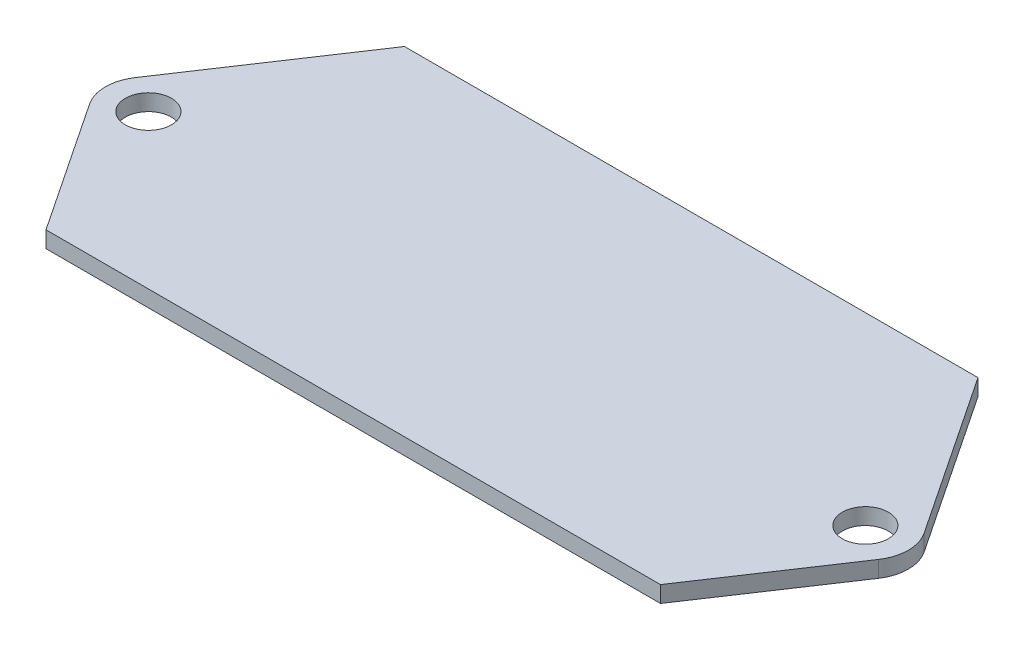
ISO-10303-21;
HEADER;
FILE_DESCRIPTION(('STEP AP214'),'2;1');
FILE_NAME('part.step','',(''),(''),'','','');
FILE_SCHEMA(('AUTOMOTIVE_DESIGN { 1 0 10303 214 1 1 1 1 }'));
ENDSEC;
DATA;
#1=APPLICATION_CONTEXT('core data for automotive mechanical design processes');
#2=APPLICATION_PROTOCOL_DEFINITION('international standard','automotive_design',2000,#1);
#3=PRODUCT_CONTEXT('',#1,'mechanical');
#4=PRODUCT('Part','Part','',(#3));
#5=PRODUCT_RELATED_PRODUCT_CATEGORY('part','',(#4));
#6=PRODUCT_DEFINITION_FORMATION('','',#4);
#7=PRODUCT_DEFINITION_CONTEXT('part definition',#1,'design');
#8=PRODUCT_DEFINITION('design','',#6,#7);
#9=PRODUCT_DEFINITION_SHAPE('','',#8);
#10=(LENGTH_UNIT() NAMED_UNIT(*) SI_UNIT(.MILLI.,.METRE.));
#11=(NAMED_UNIT(*) PLANE_ANGLE_UNIT() SI_UNIT($,.RADIAN.));
#12=(NAMED_UNIT(*) SI_UNIT($,.STERADIAN.) SOLID_ANGLE_UNIT());
#13=UNCERTAINTY_MEASURE_WITH_UNIT(LENGTH_MEASURE(1.E-05),#10,'distance_accuracy_value','');
#14=(GEOMETRIC_REPRESENTATION_CONTEXT(3) GLOBAL_UNCERTAINTY_ASSIGNED_CONTEXT((#13)) GLOBAL_UNIT_ASSIGNED_CONTEXT((#10,
#11,#12)) REPRESENTATION_CONTEXT('',''));
#15=CARTESIAN_POINT('',(0.,0.,0.));
#16=DIRECTION('',(0.,0.,1.));
#17=DIRECTION('',(1.,0.,0.));
#18=AXIS2_PLACEMENT_3D('',#15,#16,#17);
#19=CARTESIAN_POINT('',(48.4615384615385,1.6,32.3076923076923));
#20=DIRECTION('',(-0.832050294337844,0.,-0.554700196225229));
#21=DIRECTION('',(-0.554700196225229,0.,0.832050294337844));
#22=AXIS2_PLACEMENT_3D('',#19,#20,#21);
#23=PLANE('',#22);
#24=DIRECTION('',(0.554700196225229,0.,-0.832050294337844));
#25=VECTOR('',#24,1.);
#26=CARTESIAN_POINT('',(48.4615384615385,0.,32.3076923076923));
#27=LINE('',#26,#25);
#28=CARTESIAN_POINT('',(70.,0.,0.));
#29=VERTEX_POINT('',#28);
#30=CARTESIAN_POINT('',(78.5207994767327,0.,-12.7811992150991));
#31=VERTEX_POINT('',#30);
#32=EDGE_CURVE('E140',#29,#31,#27,.T.);
#33=ORIENTED_EDGE('',*,*,#32,.T.);
#34=DIRECTION('',(0.,-1.,0.));
#35=VECTOR('',#34,1.);
#36=CARTESIAN_POINT('',(78.5207994767327,1.6,-12.7811992150991));
#37=LINE('',#36,#35);
#38=CARTESIAN_POINT('',(78.5207994767327,1.6,-12.7811992150991));
#39=VERTEX_POINT('',#38);
#40=EDGE_CURVE('E164',#31,#39,#37,.F.);
#41=ORIENTED_EDGE('',*,*,#40,.T.);
#42=DIRECTION('',(0.554700196225229,0.,-0.832050294337844));
#43=VECTOR('',#42,1.);
#44=CARTESIAN_POINT('',(48.4615384615385,1.6,32.3076923076923));
#45=LINE('',#44,#43);
#46=CARTESIAN_POINT('',(70.,1.6,0.));
#47=VERTEX_POINT('',#46);
#48=EDGE_CURVE('E108',#47,#39,#45,.T.);
#49=ORIENTED_EDGE('',*,*,#48,.F.);
#50=DIRECTION('',(0.,-1.,0.));
#51=VECTOR('',#50,1.);
#52=CARTESIAN_POINT('',(70.,1.6,0.));
#53=LINE('',#52,#51);
#54=EDGE_CURVE('E133',#47,#29,#53,.T.);
#55=ORIENTED_EDGE('',*,*,#54,.T.);
#56=EDGE_LOOP('',(#33,#41,#49,#55));
#57=FACE_BOUND('',#56,.T.);
#58=ADVANCED_FACE('F34',(#57),#23,.F.);
#59=CARTESIAN_POINT('',(62.3076923076923,1.6,-41.5384615384615));
#60=DIRECTION('',(-0.832050294337844,0.,0.554700196225229));
#61=DIRECTION('',(0.554700196225229,0.,0.832050294337844));
#62=AXIS2_PLACEMENT_3D('',#59,#60,#61);
#63=PLANE('',#62);
#64=DIRECTION('',(-0.554700196225229,0.,-0.832050294337844));
#65=VECTOR('',#64,1.);
#66=CARTESIAN_POINT('',(62.3076923076923,1.6,-41.5384615384615));
#67=LINE('',#66,#65);
#68=CARTESIAN_POINT('',(78.5207994767327,1.6,-17.2188007849009));
#69=VERTEX_POINT('',#68);
#70=CARTESIAN_POINT('',(68.,1.6,-33.));
#71=VERTEX_POINT('',#70);
#72=EDGE_CURVE('E97',#69,#71,#67,.T.);
#73=ORIENTED_EDGE('',*,*,#72,.F.);
#74=DIRECTION('',(0.,-1.,0.));
#75=VECTOR('',#74,1.);
#76=CARTESIAN_POINT('',(78.5207994767327,1.6,-17.2188007849009));
#77=LINE('',#76,#75);
#78=CARTESIAN_POINT('',(78.5207994767327,0.,-17.2188007849009));
#79=VERTEX_POINT('',#78);
#80=EDGE_CURVE('E118',#69,#79,#77,.T.);
#81=ORIENTED_EDGE('',*,*,#80,.T.);
#82=DIRECTION('',(-0.554700196225229,0.,-0.832050294337844));
#83=VECTOR('',#82,1.);
#84=CARTESIAN_POINT('',(62.3076923076923,0.,-41.5384615384615));
#85=LINE('',#84,#83);
#86=CARTESIAN_POINT('',(68.,0.,-33.));
#87=VERTEX_POINT('',#86);
#88=EDGE_CURVE('E114',#79,#87,#85,.T.);
#89=ORIENTED_EDGE('',*,*,#88,.T.);
#90=DIRECTION('',(0.,-1.,0.));
#91=VECTOR('',#90,1.);
#92=CARTESIAN_POINT('',(68.,1.6,-33.));
#93=LINE('',#92,#91);
#94=EDGE_CURVE('E111',#71,#87,#93,.T.);
#95=ORIENTED_EDGE('',*,*,#94,.F.);
#96=EDGE_LOOP('',(#73,#81,#89,#95));
#97=FACE_BOUND('',#96,.T.);
#98=ADVANCED_FACE('F112',(#97),#63,.F.);
#99=CARTESIAN_POINT('',(0.,1.6,-33.));
#100=DIRECTION('',(0.,0.,-1.));
#101=DIRECTION('',(-1.,0.,0.));
#102=AXIS2_PLACEMENT_3D('',#99,#100,#101);
#103=PLANE('',#102);
#104=DIRECTION('',(1.,0.,0.));
#105=VECTOR('',#104,1.);
#106=CARTESIAN_POINT('',(0.,0.,-33.));
#107=LINE('',#106,#105);
#108=CARTESIAN_POINT('',(12.,0.,-33.));
#109=VERTEX_POINT('',#108);
#110=EDGE_CURVE('E144',#109,#87,#107,.T.);
#111=ORIENTED_EDGE('',*,*,#110,.F.);
#112=DIRECTION('',(0.,-1.,0.));
#113=VECTOR('',#112,1.);
#114=CARTESIAN_POINT('',(12.,1.6,-33.));
#115=LINE('',#114,#113);
#116=CARTESIAN_POINT('',(12.,1.6,-33.));
#117=VERTEX_POINT('',#116);
#118=EDGE_CURVE('E119',#117,#109,#115,.T.);
#119=ORIENTED_EDGE('',*,*,#118,.F.);
#120=DIRECTION('',(1.,0.,0.));
#121=VECTOR('',#120,1.);
#122=CARTESIAN_POINT('',(0.,1.6,-33.));
#123=LINE('',#122,#121);
#124=EDGE_CURVE('E102',#117,#71,#123,.T.);
#125=ORIENTED_EDGE('',*,*,#124,.T.);
#126=ORIENTED_EDGE('',*,*,#94,.T.);
#127=EDGE_LOOP('',(#111,#119,#125,#126));
#128=FACE_BOUND('',#127,.T.);
#129=ADVANCED_FACE('F122',(#128),#103,.T.);
#130=CARTESIAN_POINT('',(-6.92307692307692,1.6,-4.61538461538461));
#131=DIRECTION('',(-0.832050294337844,0.,-0.554700196225229));
#132=DIRECTION('',(-0.554700196225229,0.,0.832050294337844));
#133=AXIS2_PLACEMENT_3D('',#130,#131,#132);
#134=PLANE('',#133);
#135=DIRECTION('',(0.554700196225229,0.,-0.832050294337844));
#136=VECTOR('',#135,1.);
#137=CARTESIAN_POINT('',(-6.92307692307692,0.,-4.61538461538461));
#138=LINE('',#137,#136);
#139=CARTESIAN_POINT('',(1.47920052326728,0.,-17.2188007849009));
#140=VERTEX_POINT('',#139);
#141=EDGE_CURVE('E146',#140,#109,#138,.T.);
#142=ORIENTED_EDGE('',*,*,#141,.F.);
#143=DIRECTION('',(0.,-1.,0.));
#144=VECTOR('',#143,1.);
#145=CARTESIAN_POINT('',(1.47920052326728,1.6,-17.2188007849009));
#146=LINE('',#145,#144);
#147=CARTESIAN_POINT('',(1.47920052326728,1.6,-17.2188007849009));
#148=VERTEX_POINT('',#147);
#149=EDGE_CURVE('E11',#140,#148,#146,.F.);
#150=ORIENTED_EDGE('',*,*,#149,.T.);
#151=DIRECTION('',(0.554700196225229,0.,-0.832050294337844));
#152=VECTOR('',#151,1.);
#153=CARTESIAN_POINT('',(-6.92307692307692,1.6,-4.61538461538461));
#154=LINE('',#153,#152);
#155=EDGE_CURVE('E124',#148,#117,#154,.T.);
#156=ORIENTED_EDGE('',*,*,#155,.T.);
#157=ORIENTED_EDGE('',*,*,#118,.T.);
#158=EDGE_LOOP('',(#142,#150,#156,#157));
#159=FACE_BOUND('',#158,.T.);
#160=ADVANCED_FACE('F232',(#159),#134,.T.);
#161=CARTESIAN_POINT('',(6.92307692307692,1.6,-4.61538461538462));
#162=DIRECTION('',(0.832050294337844,0.,-0.554700196225229));
#163=DIRECTION('',(-0.554700196225229,0.,-0.832050294337844));
#164=AXIS2_PLACEMENT_3D('',#161,#162,#163);
#165=PLANE('',#164);
#166=DIRECTION('',(0.554700196225229,0.,0.832050294337844));
#167=VECTOR('',#166,1.);
#168=CARTESIAN_POINT('',(6.92307692307692,1.6,-4.61538461538462));
#169=LINE('',#168,#167);
#170=CARTESIAN_POINT('',(1.47920052326728,1.6,-12.7811992150991));
#171=VERTEX_POINT('',#170);
#172=CARTESIAN_POINT('',(10.,1.6,0.));
#173=VERTEX_POINT('',#172);
#174=EDGE_CURVE('E126',#171,#173,#169,.T.);
#175=ORIENTED_EDGE('',*,*,#174,.F.);
#176=DIRECTION('',(0.,-1.,0.));
#177=VECTOR('',#176,1.);
#178=CARTESIAN_POINT('',(1.47920052326728,0.,-12.7811992150991));
#179=LINE('',#178,#177);
#180=CARTESIAN_POINT('',(1.47920052326728,0.,-12.7811992150991));
#181=VERTEX_POINT('',#180);
#182=EDGE_CURVE('E42',#171,#181,#179,.T.);
#183=ORIENTED_EDGE('',*,*,#182,.T.);
#184=DIRECTION('',(0.554700196225229,0.,0.832050294337844));
#185=VECTOR('',#184,1.);
#186=CARTESIAN_POINT('',(6.92307692307692,0.,-4.61538461538462));
#187=LINE('',#186,#185);
#188=CARTESIAN_POINT('',(10.,0.,0.));
#189=VERTEX_POINT('',#188);
#190=EDGE_CURVE('E148',#181,#189,#187,.T.);
#191=ORIENTED_EDGE('',*,*,#190,.T.);
#192=DIRECTION('',(0.,-1.,0.));
#193=VECTOR('',#192,1.);
#194=CARTESIAN_POINT('',(10.,1.6,0.));
#195=LINE('',#194,#193);
#196=EDGE_CURVE('E155',#173,#189,#195,.T.);
#197=ORIENTED_EDGE('',*,*,#196,.F.);
#198=EDGE_LOOP('',(#175,#183,#191,#197));
#199=FACE_BOUND('',#198,.T.);
#200=ADVANCED_FACE('F171',(#199),#165,.F.);
#201=CARTESIAN_POINT('',(5.,1.6,-15.));
#202=DIRECTION('',(0.,-1.,0.));
#203=DIRECTION('',(0.,0.,-1.));
#204=AXIS2_PLACEMENT_3D('',#201,#202,#203);
#205=CYLINDRICAL_SURFACE('',#204,2.25);
#206=CARTESIAN_POINT('',(5.,1.6,-15.));
#207=DIRECTION('',(0.,1.,0.));
#208=DIRECTION('',(0.,0.,1.));
#209=AXIS2_PLACEMENT_3D('',#206,#207,#208);
#210=CIRCLE('',#209,2.25);
#211=CARTESIAN_POINT('',(5.,1.6,-12.75));
#212=VERTEX_POINT('',#211);
#213=EDGE_CURVE('E185',#212,#212,#210,.T.);
#214=ORIENTED_EDGE('',*,*,#213,.T.);
#215=EDGE_LOOP('',(#214));
#216=FACE_BOUND('',#215,.T.);
#217=CARTESIAN_POINT('',(5.,0.,-15.));
#218=DIRECTION('',(0.,1.,0.));
#219=DIRECTION('',(0.,0.,1.));
#220=AXIS2_PLACEMENT_3D('',#217,#218,#219);
#221=CIRCLE('',#220,2.25);
#222=CARTESIAN_POINT('',(5.,0.,-12.75));
#223=VERTEX_POINT('',#222);
#224=EDGE_CURVE('E137',#223,#223,#221,.T.);
#225=ORIENTED_EDGE('',*,*,#224,.F.);
#226=EDGE_LOOP('',(#225));
#227=FACE_BOUND('',#226,.T.);
#228=ADVANCED_FACE('F200',(#216,#227),#205,.F.);
#229=CARTESIAN_POINT('',(75.,1.6,-15.));
#230=DIRECTION('',(0.,-1.,0.));
#231=DIRECTION('',(0.,0.,-1.));
#232=AXIS2_PLACEMENT_3D('',#229,#230,#231);
#233=CYLINDRICAL_SURFACE('',#232,2.25);
#234=CARTESIAN_POINT('',(75.,1.6,-15.));
#235=DIRECTION('',(0.,1.,0.));
#236=DIRECTION('',(0.,0.,1.));
#237=AXIS2_PLACEMENT_3D('',#234,#235,#236);
#238=CIRCLE('',#237,2.25);
#239=CARTESIAN_POINT('',(75.,1.6,-12.75));
#240=VERTEX_POINT('',#239);
#241=EDGE_CURVE('E152',#240,#240,#238,.T.);
#242=ORIENTED_EDGE('',*,*,#241,.T.);
#243=EDGE_LOOP('',(#242));
#244=FACE_BOUND('',#243,.T.);
#245=CARTESIAN_POINT('',(75.,0.,-15.));
#246=DIRECTION('',(0.,1.,0.));
#247=DIRECTION('',(0.,0.,1.));
#248=AXIS2_PLACEMENT_3D('',#245,#246,#247);
#249=CIRCLE('',#248,2.25);
#250=CARTESIAN_POINT('',(75.,0.,-12.75));
#251=VERTEX_POINT('',#250);
#252=EDGE_CURVE('E134',#251,#251,#249,.T.);
#253=ORIENTED_EDGE('',*,*,#252,.F.);
#254=EDGE_LOOP('',(#253));
#255=FACE_BOUND('',#254,.T.);
#256=ADVANCED_FACE('F192',(#244,#255),#233,.F.);
#257=CARTESIAN_POINT('',(0.,1.6,0.));
#258=DIRECTION('',(0.,0.,-1.));
#259=DIRECTION('',(-1.,0.,0.));
#260=AXIS2_PLACEMENT_3D('',#257,#258,#259);
#261=PLANE('',#260);
#262=DIRECTION('',(1.,0.,0.));
#263=VECTOR('',#262,1.);
#264=CARTESIAN_POINT('',(0.,0.,0.));
#265=LINE('',#264,#263);
#266=EDGE_CURVE('E150',#189,#29,#265,.T.);
#267=ORIENTED_EDGE('',*,*,#266,.T.);
#268=ORIENTED_EDGE('',*,*,#54,.F.);
#269=DIRECTION('',(1.,0.,0.));
#270=VECTOR('',#269,1.);
#271=CARTESIAN_POINT('',(0.,1.6,0.));
#272=LINE('',#271,#270);
#273=EDGE_CURVE('E131',#173,#47,#272,.T.);
#274=ORIENTED_EDGE('',*,*,#273,.F.);
#275=ORIENTED_EDGE('',*,*,#196,.T.);
#276=EDGE_LOOP('',(#267,#268,#274,#275));
#277=FACE_BOUND('',#276,.T.);
#278=ADVANCED_FACE('F180',(#277),#261,.F.);
#279=CARTESIAN_POINT('',(0.,1.6,0.));
#280=DIRECTION('',(0.,1.,0.));
#281=DIRECTION('',(0.,0.,1.));
#282=AXIS2_PLACEMENT_3D('',#279,#280,#281);
#283=PLANE('',#282);
#284=ORIENTED_EDGE('',*,*,#241,.F.);
#285=EDGE_LOOP('',(#284));
#286=FACE_BOUND('',#285,.T.);
#287=ORIENTED_EDGE('',*,*,#213,.F.);
#288=EDGE_LOOP('',(#287));
#289=FACE_BOUND('',#288,.T.);
#290=ORIENTED_EDGE('',*,*,#48,.T.);
#291=CARTESIAN_POINT('',(75.1925982993814,1.6,-15.));
#292=DIRECTION('',(0.,1.,0.));
#293=DIRECTION('',(0.,0.,1.));
#294=AXIS2_PLACEMENT_3D('',#291,#292,#293);
#295=CIRCLE('',#294,4.);
#296=EDGE_CURVE('E104',#39,#69,#295,.T.);
#297=ORIENTED_EDGE('',*,*,#296,.T.);
#298=ORIENTED_EDGE('',*,*,#72,.T.);
#299=ORIENTED_EDGE('',*,*,#124,.F.);
#300=ORIENTED_EDGE('',*,*,#155,.F.);
#301=CARTESIAN_POINT('',(4.80740170061865,1.6,-15.));
#302=DIRECTION('',(0.,1.,0.));
#303=DIRECTION('',(0.,0.,1.));
#304=AXIS2_PLACEMENT_3D('',#301,#302,#303);
#305=CIRCLE('',#304,4.);
#306=EDGE_CURVE('E49',#148,#171,#305,.T.);
#307=ORIENTED_EDGE('',*,*,#306,.T.);
#308=ORIENTED_EDGE('',*,*,#174,.T.);
#309=ORIENTED_EDGE('',*,*,#273,.T.);
#310=EDGE_LOOP('',(#290,#297,#298,#299,#300,#307,#308,#309));
#311=FACE_BOUND('',#310,.T.);
#312=ADVANCED_FACE('F100',(#286,#289,#311),#283,.T.);
#313=CARTESIAN_POINT('',(0.,0.,0.));
#314=DIRECTION('',(0.,1.,0.));
#315=DIRECTION('',(0.,0.,1.));
#316=AXIS2_PLACEMENT_3D('',#313,#314,#315);
#317=PLANE('',#316);
#318=ORIENTED_EDGE('',*,*,#252,.T.);
#319=EDGE_LOOP('',(#318));
#320=FACE_BOUND('',#319,.T.);
#321=ORIENTED_EDGE('',*,*,#224,.T.);
#322=EDGE_LOOP('',(#321));
#323=FACE_BOUND('',#322,.T.);
#324=ORIENTED_EDGE('',*,*,#88,.F.);
#325=CARTESIAN_POINT('',(75.1925982993814,0.,-15.));
#326=DIRECTION('',(0.,1.,0.));
#327=DIRECTION('',(0.,0.,1.));
#328=AXIS2_PLACEMENT_3D('',#325,#326,#327);
#329=CIRCLE('',#328,4.);
#330=EDGE_CURVE('E162',#79,#31,#329,.F.);
#331=ORIENTED_EDGE('',*,*,#330,.T.);
#332=ORIENTED_EDGE('',*,*,#32,.F.);
#333=ORIENTED_EDGE('',*,*,#266,.F.);
#334=ORIENTED_EDGE('',*,*,#190,.F.);
#335=CARTESIAN_POINT('',(4.80740170061865,0.,-15.));
#336=DIRECTION('',(0.,1.,0.));
#337=DIRECTION('',(0.,0.,1.));
#338=AXIS2_PLACEMENT_3D('',#335,#336,#337);
#339=CIRCLE('',#338,4.);
#340=EDGE_CURVE('E160',#181,#140,#339,.F.);
#341=ORIENTED_EDGE('',*,*,#340,.T.);
#342=ORIENTED_EDGE('',*,*,#141,.T.);
#343=ORIENTED_EDGE('',*,*,#110,.T.);
#344=EDGE_LOOP('',(#324,#331,#332,#333,#334,#341,#342,#343));
#345=FACE_BOUND('',#344,.T.);
#346=ADVANCED_FACE('F176',(#320,#323,#345),#317,.F.);
#347=CARTESIAN_POINT('',(75.1925982993814,1.6,-15.));
#348=DIRECTION('',(0.,-1.,0.));
#349=DIRECTION('',(0.,0.,-1.));
#350=AXIS2_PLACEMENT_3D('',#347,#348,#349);
#351=CYLINDRICAL_SURFACE('',#350,4.);
#352=ORIENTED_EDGE('',*,*,#296,.F.);
#353=ORIENTED_EDGE('',*,*,#40,.F.);
#354=ORIENTED_EDGE('',*,*,#330,.F.);
#355=ORIENTED_EDGE('',*,*,#80,.F.);
#356=EDGE_LOOP('',(#352,#353,#354,#355));
#357=FACE_BOUND('',#356,.T.);
#358=ADVANCED_FACE('F207',(#357),#351,.T.);
#359=CARTESIAN_POINT('',(4.80740170061865,1.6,-15.));
#360=DIRECTION('',(0.,1.,0.));
#361=DIRECTION('',(0.,0.,1.));
#362=AXIS2_PLACEMENT_3D('',#359,#360,#361);
#363=CYLINDRICAL_SURFACE('',#362,4.);
#364=ORIENTED_EDGE('',*,*,#306,.F.);
#365=ORIENTED_EDGE('',*,*,#149,.F.);
#366=ORIENTED_EDGE('',*,*,#340,.F.);
#367=ORIENTED_EDGE('',*,*,#182,.F.);
#368=EDGE_LOOP('',(#364,#365,#366,#367));
#369=FACE_BOUND('',#368,.T.);
#370=ADVANCED_FACE('F36',(#369),#363,.T.);
#371=CLOSED_SHELL('',(#58,#98,#129,#160,#200,#228,#256,#278,#312,#346,#358,#370));
#372=MANIFOLD_SOLID_BREP('B2',#371);
#373=ADVANCED_BREP_SHAPE_REPRESENTATION('',(#18,#372),#14);
#374=SHAPE_DEFINITION_REPRESENTATION(#9,#373);
ENDSEC;
END-ISO-10303-21;
